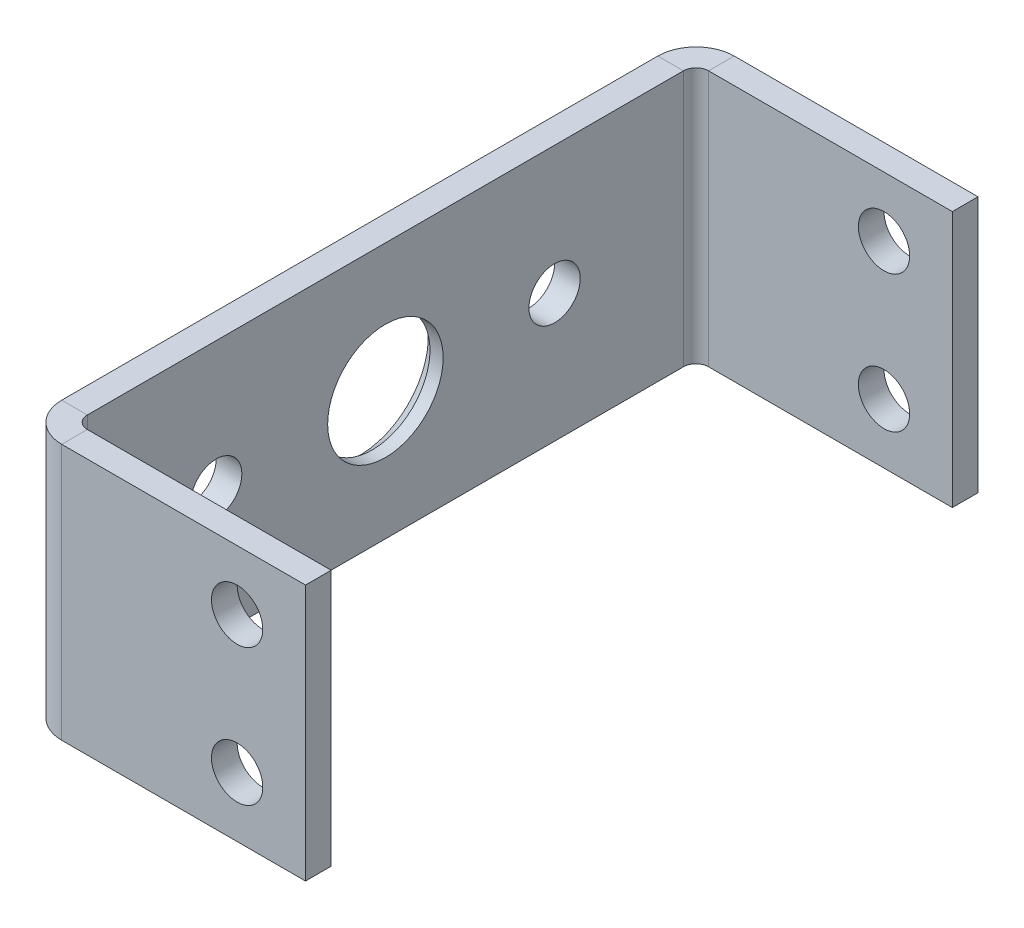
ISO-10303-21;
HEADER;
FILE_DESCRIPTION(('STEP AP214'),'2;1');
FILE_NAME('part.step','',(''),(''),'','','');
FILE_SCHEMA(('AUTOMOTIVE_DESIGN { 1 0 10303 214 1 1 1 1 }'));
ENDSEC;
DATA;
#1=APPLICATION_CONTEXT('core data for automotive mechanical design processes');
#2=APPLICATION_PROTOCOL_DEFINITION('international standard','automotive_design',2000,#1);
#3=PRODUCT_CONTEXT('',#1,'mechanical');
#4=PRODUCT('Part','Part','',(#3));
#5=PRODUCT_RELATED_PRODUCT_CATEGORY('part','',(#4));
#6=PRODUCT_DEFINITION_FORMATION('','',#4);
#7=PRODUCT_DEFINITION_CONTEXT('part definition',#1,'design');
#8=PRODUCT_DEFINITION('design','',#6,#7);
#9=PRODUCT_DEFINITION_SHAPE('','',#8);
#10=(LENGTH_UNIT() NAMED_UNIT(*) SI_UNIT(.MILLI.,.METRE.));
#11=(NAMED_UNIT(*) PLANE_ANGLE_UNIT() SI_UNIT($,.RADIAN.));
#12=(NAMED_UNIT(*) SI_UNIT($,.STERADIAN.) SOLID_ANGLE_UNIT());
#13=UNCERTAINTY_MEASURE_WITH_UNIT(LENGTH_MEASURE(1.E-05),#10,'distance_accuracy_value','');
#14=(GEOMETRIC_REPRESENTATION_CONTEXT(3) GLOBAL_UNCERTAINTY_ASSIGNED_CONTEXT((#13)) GLOBAL_UNIT_ASSIGNED_CONTEXT((#10,
#11,#12)) REPRESENTATION_CONTEXT('',''));
#15=CARTESIAN_POINT('',(0.,0.,0.));
#16=DIRECTION('',(0.,0.,1.));
#17=DIRECTION('',(1.,0.,0.));
#18=AXIS2_PLACEMENT_3D('',#15,#16,#17);
#19=CARTESIAN_POINT('',(0.,7.50000000000002,-17.4383999999999));
#20=DIRECTION('',(0.,1.,0.));
#21=DIRECTION('',(0.,0.,1.));
#22=AXIS2_PLACEMENT_3D('',#19,#20,#21);
#23=PLANE('',#22);
#24=DIRECTION('',(-1.,0.,0.));
#25=VECTOR('',#24,1.);
#26=CARTESIAN_POINT('',(0.,7.50000000000002,-17.4383999999999));
#27=LINE('',#26,#25);
#28=CARTESIAN_POINT('',(0.,7.50000000000002,-17.4383999999999));
#29=VERTEX_POINT('',#28);
#30=CARTESIAN_POINT('',(-1.5,7.50000000000002,-17.4383999999999));
#31=VERTEX_POINT('',#30);
#32=EDGE_CURVE('E11',#29,#31,#27,.T.);
#33=ORIENTED_EDGE('',*,*,#32,.F.);
#34=CARTESIAN_POINT('',(0.736600000000004,7.50000000000002,-17.4383999999999));
#35=DIRECTION('',(0.,-1.,0.));
#36=DIRECTION('',(0.,0.,-1.));
#37=AXIS2_PLACEMENT_3D('',#34,#35,#36);
#38=CIRCLE('',#37,0.7366);
#39=CARTESIAN_POINT('',(0.736600000000004,7.50000000000002,-18.1749999999999));
#40=VERTEX_POINT('',#39);
#41=EDGE_CURVE('E258',#40,#29,#38,.F.);
#42=ORIENTED_EDGE('',*,*,#41,.F.);
#43=DIRECTION('',(0.,0.,1.));
#44=VECTOR('',#43,1.);
#45=CARTESIAN_POINT('',(0.736600000000004,7.50000000000002,-19.6749999999999));
#46=LINE('',#45,#44);
#47=CARTESIAN_POINT('',(0.736600000000004,7.50000000000002,-19.6749999999999));
#48=VERTEX_POINT('',#47);
#49=EDGE_CURVE('E54',#48,#40,#46,.T.);
#50=ORIENTED_EDGE('',*,*,#49,.F.);
#51=CARTESIAN_POINT('',(0.736600000000004,7.50000000000002,-17.4383999999999));
#52=DIRECTION('',(0.,1.,0.));
#53=DIRECTION('',(1.,0.,0.));
#54=AXIS2_PLACEMENT_3D('',#51,#52,#53);
#55=CIRCLE('',#54,2.2366);
#56=EDGE_CURVE('E155',#48,#31,#55,.T.);
#57=ORIENTED_EDGE('',*,*,#56,.T.);
#58=EDGE_LOOP('',(#33,#42,#50,#57));
#59=FACE_BOUND('',#58,.T.);
#60=ADVANCED_FACE('F45',(#59),#23,.T.);
#61=CARTESIAN_POINT('',(0.736600000000004,7.50000000000002,-19.6749999999999));
#62=DIRECTION('',(0.,1.,0.));
#63=DIRECTION('',(0.,0.,1.));
#64=AXIS2_PLACEMENT_3D('',#61,#62,#63);
#65=PLANE('',#64);
#66=DIRECTION('',(0.,0.,1.));
#67=VECTOR('',#66,1.);
#68=CARTESIAN_POINT('',(0.,7.50000000000002,-18.1749999999999));
#69=LINE('',#68,#67);
#70=CARTESIAN_POINT('',(0.,7.50000000000002,17.4384000000001));
#71=VERTEX_POINT('',#70);
#72=EDGE_CURVE('E149',#29,#71,#69,.T.);
#73=ORIENTED_EDGE('',*,*,#72,.F.);
#74=ORIENTED_EDGE('',*,*,#32,.T.);
#75=DIRECTION('',(0.,0.,-1.));
#76=VECTOR('',#75,1.);
#77=CARTESIAN_POINT('',(-1.5,7.50000000000002,-18.1749999999999));
#78=LINE('',#77,#76);
#79=CARTESIAN_POINT('',(-1.5,7.50000000000002,17.4384000000001));
#80=VERTEX_POINT('',#79);
#81=EDGE_CURVE('E146',#31,#80,#78,.F.);
#82=ORIENTED_EDGE('',*,*,#81,.T.);
#83=DIRECTION('',(1.,0.,0.));
#84=VECTOR('',#83,1.);
#85=CARTESIAN_POINT('',(-1.5,7.50000000000002,17.4384000000001));
#86=LINE('',#85,#84);
#87=EDGE_CURVE('E238',#80,#71,#86,.T.);
#88=ORIENTED_EDGE('',*,*,#87,.T.);
#89=EDGE_LOOP('',(#73,#74,#82,#88));
#90=FACE_BOUND('',#89,.T.);
#91=ADVANCED_FACE('F144',(#90),#65,.T.);
#92=CARTESIAN_POINT('',(0.736600000000004,-7.49999999999998,-18.1749999999999));
#93=DIRECTION('',(0.,-1.,0.));
#94=DIRECTION('',(0.,0.,-1.));
#95=AXIS2_PLACEMENT_3D('',#92,#93,#94);
#96=PLANE('',#95);
#97=DIRECTION('',(0.,0.,-1.));
#98=VECTOR('',#97,1.);
#99=CARTESIAN_POINT('',(0.736600000000004,-7.49999999999998,-18.1749999999999));
#100=LINE('',#99,#98);
#101=CARTESIAN_POINT('',(0.736600000000004,-7.49999999999998,-18.1749999999999));
#102=VERTEX_POINT('',#101);
#103=CARTESIAN_POINT('',(0.736600000000004,-7.49999999999998,-19.6749999999999));
#104=VERTEX_POINT('',#103);
#105=EDGE_CURVE('E243',#102,#104,#100,.T.);
#106=ORIENTED_EDGE('',*,*,#105,.F.);
#107=CARTESIAN_POINT('',(0.736600000000004,-7.49999999999998,-17.4383999999999));
#108=DIRECTION('',(0.,-1.,0.));
#109=DIRECTION('',(0.,0.,-1.));
#110=AXIS2_PLACEMENT_3D('',#107,#108,#109);
#111=CIRCLE('',#110,0.7366);
#112=CARTESIAN_POINT('',(0.,-7.49999999999998,-17.4383999999999));
#113=VERTEX_POINT('',#112);
#114=EDGE_CURVE('E195',#102,#113,#111,.F.);
#115=ORIENTED_EDGE('',*,*,#114,.T.);
#116=DIRECTION('',(1.,0.,0.));
#117=VECTOR('',#116,1.);
#118=CARTESIAN_POINT('',(-1.5,-7.49999999999998,-17.4383999999999));
#119=LINE('',#118,#117);
#120=CARTESIAN_POINT('',(-1.5,-7.49999999999998,-17.4383999999999));
#121=VERTEX_POINT('',#120);
#122=EDGE_CURVE('E241',#121,#113,#119,.T.);
#123=ORIENTED_EDGE('',*,*,#122,.F.);
#124=CARTESIAN_POINT('',(0.736600000000004,-7.49999999999998,-17.4383999999999));
#125=DIRECTION('',(0.,1.,0.));
#126=DIRECTION('',(1.,0.,0.));
#127=AXIS2_PLACEMENT_3D('',#124,#125,#126);
#128=CIRCLE('',#127,2.2366);
#129=EDGE_CURVE('E167',#104,#121,#128,.T.);
#130=ORIENTED_EDGE('',*,*,#129,.F.);
#131=EDGE_LOOP('',(#106,#115,#123,#130));
#132=FACE_BOUND('',#131,.T.);
#133=ADVANCED_FACE('F350',(#132),#96,.T.);
#134=CARTESIAN_POINT('',(-1.5,-7.49999999999998,-17.4383999999999));
#135=DIRECTION('',(0.,-1.,0.));
#136=DIRECTION('',(0.,0.,-1.));
#137=AXIS2_PLACEMENT_3D('',#134,#135,#136);
#138=PLANE('',#137);
#139=DIRECTION('',(-1.,0.,0.));
#140=VECTOR('',#139,1.);
#141=CARTESIAN_POINT('',(15.,-7.49999999999998,-18.1749999999999));
#142=LINE('',#141,#140);
#143=CARTESIAN_POINT('',(15.,-7.49999999999998,-18.1749999999999));
#144=VERTEX_POINT('',#143);
#145=EDGE_CURVE('E198',#144,#102,#142,.T.);
#146=ORIENTED_EDGE('',*,*,#145,.T.);
#147=ORIENTED_EDGE('',*,*,#105,.T.);
#148=DIRECTION('',(1.,0.,0.));
#149=VECTOR('',#148,1.);
#150=CARTESIAN_POINT('',(15.,-7.49999999999998,-19.6749999999999));
#151=LINE('',#150,#149);
#152=CARTESIAN_POINT('',(15.,-7.49999999999998,-19.6749999999999));
#153=VERTEX_POINT('',#152);
#154=EDGE_CURVE('E204',#153,#104,#151,.F.);
#155=ORIENTED_EDGE('',*,*,#154,.F.);
#156=DIRECTION('',(0.,0.,1.));
#157=VECTOR('',#156,1.);
#158=CARTESIAN_POINT('',(15.,-7.49999999999998,-19.6749999999999));
#159=LINE('',#158,#157);
#160=EDGE_CURVE('E201',#153,#144,#159,.T.);
#161=ORIENTED_EDGE('',*,*,#160,.T.);
#162=EDGE_LOOP('',(#146,#147,#155,#161));
#163=FACE_BOUND('',#162,.T.);
#164=ADVANCED_FACE('F354',(#163),#138,.T.);
#165=CARTESIAN_POINT('',(0.736600000000004,7.50000000000002,18.1750000000001));
#166=DIRECTION('',(0.,1.,0.));
#167=DIRECTION('',(0.,0.,1.));
#168=AXIS2_PLACEMENT_3D('',#165,#166,#167);
#169=PLANE('',#168);
#170=DIRECTION('',(0.,0.,1.));
#171=VECTOR('',#170,1.);
#172=CARTESIAN_POINT('',(0.736600000000004,7.50000000000002,18.1750000000001));
#173=LINE('',#172,#171);
#174=CARTESIAN_POINT('',(0.736600000000004,7.50000000000002,18.1750000000001));
#175=VERTEX_POINT('',#174);
#176=CARTESIAN_POINT('',(0.736600000000004,7.50000000000002,19.6750000000001));
#177=VERTEX_POINT('',#176);
#178=EDGE_CURVE('E62',#175,#177,#173,.T.);
#179=ORIENTED_EDGE('',*,*,#178,.F.);
#180=CARTESIAN_POINT('',(0.736600000000004,7.50000000000002,17.4384000000001));
#181=DIRECTION('',(0.,-1.,0.));
#182=DIRECTION('',(0.,0.,-1.));
#183=AXIS2_PLACEMENT_3D('',#180,#181,#182);
#184=CIRCLE('',#183,0.7366);
#185=EDGE_CURVE('E268',#71,#175,#184,.F.);
#186=ORIENTED_EDGE('',*,*,#185,.F.);
#187=ORIENTED_EDGE('',*,*,#87,.F.);
#188=CARTESIAN_POINT('',(0.736600000000004,7.50000000000002,17.4384000000001));
#189=DIRECTION('',(0.,1.,0.));
#190=DIRECTION('',(1.,0.,0.));
#191=AXIS2_PLACEMENT_3D('',#188,#189,#190);
#192=CIRCLE('',#191,2.2366);
#193=EDGE_CURVE('E175',#80,#177,#192,.T.);
#194=ORIENTED_EDGE('',*,*,#193,.T.);
#195=EDGE_LOOP('',(#179,#186,#187,#194));
#196=FACE_BOUND('',#195,.T.);
#197=ADVANCED_FACE('F360',(#196),#169,.T.);
#198=CARTESIAN_POINT('',(-1.5,7.50000000000002,17.4384000000001));
#199=DIRECTION('',(0.,1.,0.));
#200=DIRECTION('',(0.,0.,1.));
#201=AXIS2_PLACEMENT_3D('',#198,#199,#200);
#202=PLANE('',#201);
#203=DIRECTION('',(1.,0.,0.));
#204=VECTOR('',#203,1.);
#205=CARTESIAN_POINT('',(0.,7.50000000000002,18.1750000000001));
#206=LINE('',#205,#204);
#207=CARTESIAN_POINT('',(15.,7.50000000000002,18.1750000000001));
#208=VERTEX_POINT('',#207);
#209=EDGE_CURVE('E271',#175,#208,#206,.T.);
#210=ORIENTED_EDGE('',*,*,#209,.F.);
#211=ORIENTED_EDGE('',*,*,#178,.T.);
#212=DIRECTION('',(1.,0.,0.));
#213=VECTOR('',#212,1.);
#214=CARTESIAN_POINT('',(0.,7.50000000000002,19.6750000000001));
#215=LINE('',#214,#213);
#216=CARTESIAN_POINT('',(15.,7.50000000000002,19.6750000000001));
#217=VERTEX_POINT('',#216);
#218=EDGE_CURVE('E116',#177,#217,#215,.T.);
#219=ORIENTED_EDGE('',*,*,#218,.T.);
#220=DIRECTION('',(0.,0.,1.));
#221=VECTOR('',#220,1.);
#222=CARTESIAN_POINT('',(15.,7.50000000000002,18.1750000000001));
#223=LINE('',#222,#221);
#224=EDGE_CURVE('E274',#208,#217,#223,.T.);
#225=ORIENTED_EDGE('',*,*,#224,.F.);
#226=EDGE_LOOP('',(#210,#211,#219,#225));
#227=FACE_BOUND('',#226,.T.);
#228=ADVANCED_FACE('F364',(#227),#202,.T.);
#229=CARTESIAN_POINT('',(0.,-7.49999999999998,17.4384000000001));
#230=DIRECTION('',(0.,-1.,0.));
#231=DIRECTION('',(0.,0.,-1.));
#232=AXIS2_PLACEMENT_3D('',#229,#230,#231);
#233=PLANE('',#232);
#234=DIRECTION('',(-1.,0.,0.));
#235=VECTOR('',#234,1.);
#236=CARTESIAN_POINT('',(0.,-7.49999999999998,17.4384000000001));
#237=LINE('',#236,#235);
#238=CARTESIAN_POINT('',(0.,-7.49999999999998,17.4384000000001));
#239=VERTEX_POINT('',#238);
#240=CARTESIAN_POINT('',(-1.5,-7.49999999999998,17.4384000000001));
#241=VERTEX_POINT('',#240);
#242=EDGE_CURVE('E103',#239,#241,#237,.T.);
#243=ORIENTED_EDGE('',*,*,#242,.F.);
#244=CARTESIAN_POINT('',(0.736600000000004,-7.49999999999998,17.4384000000001));
#245=DIRECTION('',(0.,-1.,0.));
#246=DIRECTION('',(0.,0.,-1.));
#247=AXIS2_PLACEMENT_3D('',#244,#245,#246);
#248=CIRCLE('',#247,0.7366);
#249=CARTESIAN_POINT('',(0.736600000000004,-7.49999999999998,18.1750000000001));
#250=VERTEX_POINT('',#249);
#251=EDGE_CURVE('E191',#239,#250,#248,.F.);
#252=ORIENTED_EDGE('',*,*,#251,.T.);
#253=DIRECTION('',(0.,0.,-1.));
#254=VECTOR('',#253,1.);
#255=CARTESIAN_POINT('',(0.736600000000004,-7.49999999999998,19.6750000000001));
#256=LINE('',#255,#254);
#257=CARTESIAN_POINT('',(0.736600000000004,-7.49999999999998,19.6750000000001));
#258=VERTEX_POINT('',#257);
#259=EDGE_CURVE('E110',#258,#250,#256,.T.);
#260=ORIENTED_EDGE('',*,*,#259,.F.);
#261=CARTESIAN_POINT('',(0.736600000000004,-7.49999999999998,17.4384000000001));
#262=DIRECTION('',(0.,1.,0.));
#263=DIRECTION('',(1.,0.,0.));
#264=AXIS2_PLACEMENT_3D('',#261,#262,#263);
#265=CIRCLE('',#264,2.2366);
#266=EDGE_CURVE('E210',#241,#258,#265,.T.);
#267=ORIENTED_EDGE('',*,*,#266,.F.);
#268=EDGE_LOOP('',(#243,#252,#260,#267));
#269=FACE_BOUND('',#268,.T.);
#270=ADVANCED_FACE('F368',(#269),#233,.T.);
#271=CARTESIAN_POINT('',(0.736600000000004,-7.49999999999998,19.6750000000001));
#272=DIRECTION('',(0.,-1.,0.));
#273=DIRECTION('',(0.,0.,-1.));
#274=AXIS2_PLACEMENT_3D('',#271,#272,#273);
#275=PLANE('',#274);
#276=DIRECTION('',(0.,0.,1.));
#277=VECTOR('',#276,1.);
#278=CARTESIAN_POINT('',(0.,-7.49999999999998,-18.1749999999999));
#279=LINE('',#278,#277);
#280=EDGE_CURVE('E193',#113,#239,#279,.T.);
#281=ORIENTED_EDGE('',*,*,#280,.T.);
#282=ORIENTED_EDGE('',*,*,#242,.T.);
#283=DIRECTION('',(0.,0.,-1.));
#284=VECTOR('',#283,1.);
#285=CARTESIAN_POINT('',(-1.5,-7.49999999999998,-18.1749999999999));
#286=LINE('',#285,#284);
#287=EDGE_CURVE('E208',#121,#241,#286,.F.);
#288=ORIENTED_EDGE('',*,*,#287,.F.);
#289=ORIENTED_EDGE('',*,*,#122,.T.);
#290=EDGE_LOOP('',(#281,#282,#288,#289));
#291=FACE_BOUND('',#290,.T.);
#292=ADVANCED_FACE('F371',(#291),#275,.T.);
#293=CARTESIAN_POINT('',(0.,7.50000000000002,19.6750000000001));
#294=DIRECTION('',(0.,0.,-1.));
#295=DIRECTION('',(-1.,0.,0.));
#296=AXIS2_PLACEMENT_3D('',#293,#294,#295);
#297=PLANE('',#296);
#298=CARTESIAN_POINT('',(11.,-4.,19.6750000000001));
#299=DIRECTION('',(0.,0.,-1.));
#300=DIRECTION('',(-1.,0.,0.));
#301=AXIS2_PLACEMENT_3D('',#298,#299,#300);
#302=CIRCLE('',#301,1.5);
#303=CARTESIAN_POINT('',(9.5,-4.,19.6750000000001));
#304=VERTEX_POINT('',#303);
#305=EDGE_CURVE('E295',#304,#304,#302,.T.);
#306=ORIENTED_EDGE('',*,*,#305,.T.);
#307=EDGE_LOOP('',(#306));
#308=FACE_BOUND('',#307,.T.);
#309=CARTESIAN_POINT('',(11.,4.,19.6750000000001));
#310=DIRECTION('',(0.,0.,-1.));
#311=DIRECTION('',(-1.,0.,0.));
#312=AXIS2_PLACEMENT_3D('',#309,#310,#311);
#313=CIRCLE('',#312,1.49999999999998);
#314=CARTESIAN_POINT('',(9.50000000000002,4.,19.6750000000001));
#315=VERTEX_POINT('',#314);
#316=EDGE_CURVE('E283',#315,#315,#313,.T.);
#317=ORIENTED_EDGE('',*,*,#316,.T.);
#318=EDGE_LOOP('',(#317));
#319=FACE_BOUND('',#318,.T.);
#320=DIRECTION('',(1.,0.,0.));
#321=VECTOR('',#320,1.);
#322=CARTESIAN_POINT('',(0.,-7.49999999999998,19.6750000000001));
#323=LINE('',#322,#321);
#324=CARTESIAN_POINT('',(15.,-7.49999999999998,19.6750000000001));
#325=VERTEX_POINT('',#324);
#326=EDGE_CURVE('E181',#258,#325,#323,.T.);
#327=ORIENTED_EDGE('',*,*,#326,.T.);
#328=DIRECTION('',(0.,-1.,0.));
#329=VECTOR('',#328,1.);
#330=CARTESIAN_POINT('',(15.,7.50000000000002,19.6750000000001));
#331=LINE('',#330,#329);
#332=EDGE_CURVE('E234',#217,#325,#331,.T.);
#333=ORIENTED_EDGE('',*,*,#332,.F.);
#334=ORIENTED_EDGE('',*,*,#218,.F.);
#335=DIRECTION('',(0.,-1.,0.));
#336=VECTOR('',#335,1.);
#337=CARTESIAN_POINT('',(0.736600000000004,7.50000000000002,19.6750000000001));
#338=LINE('',#337,#336);
#339=EDGE_CURVE('E177',#177,#258,#338,.T.);
#340=ORIENTED_EDGE('',*,*,#339,.T.);
#341=EDGE_LOOP('',(#327,#333,#334,#340));
#342=FACE_BOUND('',#341,.T.);
#343=ADVANCED_FACE('F374',(#308,#319,#342),#297,.F.);
#344=CARTESIAN_POINT('',(15.,7.50000000000002,18.1750000000001));
#345=DIRECTION('',(1.,0.,0.));
#346=DIRECTION('',(0.,0.,-1.));
#347=AXIS2_PLACEMENT_3D('',#344,#345,#346);
#348=PLANE('',#347);
#349=DIRECTION('',(0.,0.,1.));
#350=VECTOR('',#349,1.);
#351=CARTESIAN_POINT('',(15.,-7.49999999999998,18.1750000000001));
#352=LINE('',#351,#350);
#353=CARTESIAN_POINT('',(15.,-7.49999999999998,18.1750000000001));
#354=VERTEX_POINT('',#353);
#355=EDGE_CURVE('E184',#354,#325,#352,.T.);
#356=ORIENTED_EDGE('',*,*,#355,.F.);
#357=DIRECTION('',(0.,-1.,0.));
#358=VECTOR('',#357,1.);
#359=CARTESIAN_POINT('',(15.,7.50000000000002,18.1750000000001));
#360=LINE('',#359,#358);
#361=EDGE_CURVE('E232',#208,#354,#360,.T.);
#362=ORIENTED_EDGE('',*,*,#361,.F.);
#363=ORIENTED_EDGE('',*,*,#224,.T.);
#364=ORIENTED_EDGE('',*,*,#332,.T.);
#365=EDGE_LOOP('',(#356,#362,#363,#364));
#366=FACE_BOUND('',#365,.T.);
#367=ADVANCED_FACE('F377',(#366),#348,.T.);
#368=CARTESIAN_POINT('',(0.,7.50000000000002,18.1750000000001));
#369=DIRECTION('',(0.,0.,-1.));
#370=DIRECTION('',(-1.,0.,0.));
#371=AXIS2_PLACEMENT_3D('',#368,#369,#370);
#372=PLANE('',#371);
#373=CARTESIAN_POINT('',(11.,-4.,18.1750000000001));
#374=DIRECTION('',(0.,0.,-1.));
#375=DIRECTION('',(-1.,0.,0.));
#376=AXIS2_PLACEMENT_3D('',#373,#374,#375);
#377=CIRCLE('',#376,1.5);
#378=CARTESIAN_POINT('',(9.5,-4.,18.1750000000001));
#379=VERTEX_POINT('',#378);
#380=EDGE_CURVE('E287',#379,#379,#377,.T.);
#381=ORIENTED_EDGE('',*,*,#380,.F.);
#382=EDGE_LOOP('',(#381));
#383=FACE_BOUND('',#382,.T.);
#384=CARTESIAN_POINT('',(11.,4.,18.1750000000001));
#385=DIRECTION('',(0.,0.,-1.));
#386=DIRECTION('',(-1.,0.,0.));
#387=AXIS2_PLACEMENT_3D('',#384,#385,#386);
#388=CIRCLE('',#387,1.49999999999998);
#389=CARTESIAN_POINT('',(9.50000000000002,4.,18.1750000000001));
#390=VERTEX_POINT('',#389);
#391=EDGE_CURVE('E185',#390,#390,#388,.T.);
#392=ORIENTED_EDGE('',*,*,#391,.F.);
#393=EDGE_LOOP('',(#392));
#394=FACE_BOUND('',#393,.T.);
#395=DIRECTION('',(1.,0.,0.));
#396=VECTOR('',#395,1.);
#397=CARTESIAN_POINT('',(0.,-7.49999999999998,18.1750000000001));
#398=LINE('',#397,#396);
#399=EDGE_CURVE('E188',#250,#354,#398,.T.);
#400=ORIENTED_EDGE('',*,*,#399,.F.);
#401=DIRECTION('',(0.,-1.,0.));
#402=VECTOR('',#401,1.);
#403=CARTESIAN_POINT('',(0.736600000000004,7.50000000000002,18.1750000000001));
#404=LINE('',#403,#402);
#405=EDGE_CURVE('E229',#175,#250,#404,.T.);
#406=ORIENTED_EDGE('',*,*,#405,.F.);
#407=ORIENTED_EDGE('',*,*,#209,.T.);
#408=ORIENTED_EDGE('',*,*,#361,.T.);
#409=EDGE_LOOP('',(#400,#406,#407,#408));
#410=FACE_BOUND('',#409,.T.);
#411=ADVANCED_FACE('F381',(#383,#394,#410),#372,.T.);
#412=CARTESIAN_POINT('',(0.736600000000004,7.50000000000002,17.4384000000001));
#413=DIRECTION('',(0.,-1.,0.));
#414=DIRECTION('',(0.,0.,-1.));
#415=AXIS2_PLACEMENT_3D('',#412,#413,#414);
#416=CYLINDRICAL_SURFACE('',#415,0.7366);
#417=ORIENTED_EDGE('',*,*,#251,.F.);
#418=DIRECTION('',(0.,-1.,0.));
#419=VECTOR('',#418,1.);
#420=CARTESIAN_POINT('',(0.,7.50000000000002,17.4384000000001));
#421=LINE('',#420,#419);
#422=EDGE_CURVE('E226',#71,#239,#421,.T.);
#423=ORIENTED_EDGE('',*,*,#422,.F.);
#424=ORIENTED_EDGE('',*,*,#185,.T.);
#425=ORIENTED_EDGE('',*,*,#405,.T.);
#426=EDGE_LOOP('',(#417,#423,#424,#425));
#427=FACE_BOUND('',#426,.T.);
#428=ADVANCED_FACE('F385',(#427),#416,.F.);
#429=CARTESIAN_POINT('',(0.,7.50000000000002,-18.1749999999999));
#430=DIRECTION('',(1.,0.,0.));
#431=DIRECTION('',(0.,0.,-1.));
#432=AXIS2_PLACEMENT_3D('',#429,#430,#431);
#433=PLANE('',#432);
#434=CARTESIAN_POINT('',(0.,0.,0.));
#435=DIRECTION('',(1.,0.,0.));
#436=DIRECTION('',(0.,0.,-1.));
#437=AXIS2_PLACEMENT_3D('',#434,#435,#436);
#438=CIRCLE('',#437,3.3782);
#439=CARTESIAN_POINT('',(0.,0.,-3.3782));
#440=VERTEX_POINT('',#439);
#441=EDGE_CURVE('E48',#440,#440,#438,.T.);
#442=ORIENTED_EDGE('',*,*,#441,.F.);
#443=EDGE_LOOP('',(#442));
#444=FACE_BOUND('',#443,.T.);
#445=CARTESIAN_POINT('',(0.,3.0162415030313E-13,9.9000000000003));
#446=DIRECTION('',(1.,0.,0.));
#447=DIRECTION('',(0.,1.,0.));
#448=AXIS2_PLACEMENT_3D('',#445,#446,#447);
#449=CIRCLE('',#448,1.5);
#450=CARTESIAN_POINT('',(0.,1.5000000000003,9.9000000000003));
#451=VERTEX_POINT('',#450);
#452=EDGE_CURVE('E310',#451,#451,#449,.T.);
#453=ORIENTED_EDGE('',*,*,#452,.F.);
#454=EDGE_LOOP('',(#453));
#455=FACE_BOUND('',#454,.T.);
#456=CARTESIAN_POINT('',(0.,-3.01624150303112E-13,-9.8999999999997));
#457=DIRECTION('',(1.,0.,0.));
#458=DIRECTION('',(0.,1.,0.));
#459=AXIS2_PLACEMENT_3D('',#456,#457,#458);
#460=CIRCLE('',#459,1.5);
#461=CARTESIAN_POINT('',(0.,1.4999999999997,-9.8999999999997));
#462=VERTEX_POINT('',#461);
#463=EDGE_CURVE('E304',#462,#462,#460,.T.);
#464=ORIENTED_EDGE('',*,*,#463,.F.);
#465=EDGE_LOOP('',(#464));
#466=FACE_BOUND('',#465,.T.);
#467=ORIENTED_EDGE('',*,*,#280,.F.);
#468=DIRECTION('',(0.,-1.,0.));
#469=VECTOR('',#468,1.);
#470=CARTESIAN_POINT('',(0.,7.50000000000002,-17.4383999999999));
#471=LINE('',#470,#469);
#472=EDGE_CURVE('E223',#29,#113,#471,.T.);
#473=ORIENTED_EDGE('',*,*,#472,.F.);
#474=ORIENTED_EDGE('',*,*,#72,.T.);
#475=ORIENTED_EDGE('',*,*,#422,.T.);
#476=EDGE_LOOP('',(#467,#473,#474,#475));
#477=FACE_BOUND('',#476,.T.);
#478=ADVANCED_FACE('F389',(#444,#455,#466,#477),#433,.T.);
#479=CARTESIAN_POINT('',(0.736600000000004,7.50000000000002,-17.4383999999999));
#480=DIRECTION('',(0.,-1.,0.));
#481=DIRECTION('',(0.,0.,-1.));
#482=AXIS2_PLACEMENT_3D('',#479,#480,#481);
#483=CYLINDRICAL_SURFACE('',#482,0.7366);
#484=ORIENTED_EDGE('',*,*,#114,.F.);
#485=DIRECTION('',(0.,-1.,0.));
#486=VECTOR('',#485,1.);
#487=CARTESIAN_POINT('',(0.736600000000004,7.50000000000002,-18.1749999999999));
#488=LINE('',#487,#486);
#489=EDGE_CURVE('E220',#40,#102,#488,.T.);
#490=ORIENTED_EDGE('',*,*,#489,.F.);
#491=ORIENTED_EDGE('',*,*,#41,.T.);
#492=ORIENTED_EDGE('',*,*,#472,.T.);
#493=EDGE_LOOP('',(#484,#490,#491,#492));
#494=FACE_BOUND('',#493,.T.);
#495=ADVANCED_FACE('F257',(#494),#483,.F.);
#496=CARTESIAN_POINT('',(15.,7.50000000000002,-18.1749999999999));
#497=DIRECTION('',(0.,0.,1.));
#498=DIRECTION('',(1.,0.,0.));
#499=AXIS2_PLACEMENT_3D('',#496,#497,#498);
#500=PLANE('',#499);
#501=CARTESIAN_POINT('',(11.,-4.,-18.1749999999999));
#502=DIRECTION('',(0.,0.,1.));
#503=DIRECTION('',(1.,0.,0.));
#504=AXIS2_PLACEMENT_3D('',#501,#502,#503);
#505=CIRCLE('',#504,1.5);
#506=CARTESIAN_POINT('',(12.5,-4.,-18.1749999999999));
#507=VERTEX_POINT('',#506);
#508=EDGE_CURVE('E292',#507,#507,#505,.T.);
#509=ORIENTED_EDGE('',*,*,#508,.F.);
#510=EDGE_LOOP('',(#509));
#511=FACE_BOUND('',#510,.T.);
#512=CARTESIAN_POINT('',(11.,4.,-18.1749999999999));
#513=DIRECTION('',(0.,0.,1.));
#514=DIRECTION('',(1.,0.,0.));
#515=AXIS2_PLACEMENT_3D('',#512,#513,#514);
#516=CIRCLE('',#515,1.49999999999998);
#517=CARTESIAN_POINT('',(12.5,4.,-18.1749999999999));
#518=VERTEX_POINT('',#517);
#519=EDGE_CURVE('E280',#518,#518,#516,.T.);
#520=ORIENTED_EDGE('',*,*,#519,.F.);
#521=EDGE_LOOP('',(#520));
#522=FACE_BOUND('',#521,.T.);
#523=ORIENTED_EDGE('',*,*,#145,.F.);
#524=DIRECTION('',(0.,-1.,0.));
#525=VECTOR('',#524,1.);
#526=CARTESIAN_POINT('',(15.,7.50000000000002,-18.1749999999999));
#527=LINE('',#526,#525);
#528=CARTESIAN_POINT('',(15.,7.50000000000002,-18.1749999999999));
#529=VERTEX_POINT('',#528);
#530=EDGE_CURVE('E218',#529,#144,#527,.T.);
#531=ORIENTED_EDGE('',*,*,#530,.F.);
#532=DIRECTION('',(-1.,0.,0.));
#533=VECTOR('',#532,1.);
#534=CARTESIAN_POINT('',(15.,7.50000000000002,-18.1749999999999));
#535=LINE('',#534,#533);
#536=EDGE_CURVE('E251',#529,#40,#535,.T.);
#537=ORIENTED_EDGE('',*,*,#536,.T.);
#538=ORIENTED_EDGE('',*,*,#489,.T.);
#539=EDGE_LOOP('',(#523,#531,#537,#538));
#540=FACE_BOUND('',#539,.T.);
#541=ADVANCED_FACE('F262',(#511,#522,#540),#500,.T.);
#542=CARTESIAN_POINT('',(15.,7.50000000000002,-19.6749999999999));
#543=DIRECTION('',(1.,0.,0.));
#544=DIRECTION('',(0.,0.,-1.));
#545=AXIS2_PLACEMENT_3D('',#542,#543,#544);
#546=PLANE('',#545);
#547=ORIENTED_EDGE('',*,*,#160,.F.);
#548=DIRECTION('',(0.,-1.,0.));
#549=VECTOR('',#548,1.);
#550=CARTESIAN_POINT('',(15.,7.50000000000002,-19.6749999999999));
#551=LINE('',#550,#549);
#552=CARTESIAN_POINT('',(15.,7.50000000000002,-19.6749999999999));
#553=VERTEX_POINT('',#552);
#554=EDGE_CURVE('E216',#553,#153,#551,.T.);
#555=ORIENTED_EDGE('',*,*,#554,.F.);
#556=DIRECTION('',(0.,0.,1.));
#557=VECTOR('',#556,1.);
#558=CARTESIAN_POINT('',(15.,7.50000000000002,-19.6749999999999));
#559=LINE('',#558,#557);
#560=EDGE_CURVE('E263',#553,#529,#559,.T.);
#561=ORIENTED_EDGE('',*,*,#560,.T.);
#562=ORIENTED_EDGE('',*,*,#530,.T.);
#563=EDGE_LOOP('',(#547,#555,#561,#562));
#564=FACE_BOUND('',#563,.T.);
#565=ADVANCED_FACE('F398',(#564),#546,.T.);
#566=CARTESIAN_POINT('',(15.,7.50000000000002,-19.6749999999999));
#567=DIRECTION('',(0.,0.,1.));
#568=DIRECTION('',(1.,0.,0.));
#569=AXIS2_PLACEMENT_3D('',#566,#567,#568);
#570=PLANE('',#569);
#571=CARTESIAN_POINT('',(11.,-4.,-19.6749999999999));
#572=DIRECTION('',(0.,0.,-1.));
#573=DIRECTION('',(-1.,0.,0.));
#574=AXIS2_PLACEMENT_3D('',#571,#572,#573);
#575=CIRCLE('',#574,1.5);
#576=CARTESIAN_POINT('',(9.5,-4.,-19.6749999999999));
#577=VERTEX_POINT('',#576);
#578=EDGE_CURVE('E296',#577,#577,#575,.T.);
#579=ORIENTED_EDGE('',*,*,#578,.F.);
#580=EDGE_LOOP('',(#579));
#581=FACE_BOUND('',#580,.T.);
#582=CARTESIAN_POINT('',(11.,4.,-19.6749999999999));
#583=DIRECTION('',(0.,0.,-1.));
#584=DIRECTION('',(-1.,0.,0.));
#585=AXIS2_PLACEMENT_3D('',#582,#583,#584);
#586=CIRCLE('',#585,1.49999999999998);
#587=CARTESIAN_POINT('',(9.50000000000002,4.,-19.6749999999999));
#588=VERTEX_POINT('',#587);
#589=EDGE_CURVE('E284',#588,#588,#586,.T.);
#590=ORIENTED_EDGE('',*,*,#589,.F.);
#591=EDGE_LOOP('',(#590));
#592=FACE_BOUND('',#591,.T.);
#593=ORIENTED_EDGE('',*,*,#154,.T.);
#594=DIRECTION('',(0.,-1.,0.));
#595=VECTOR('',#594,1.);
#596=CARTESIAN_POINT('',(0.736600000000004,7.50000000000002,-19.6749999999999));
#597=LINE('',#596,#595);
#598=EDGE_CURVE('E169',#48,#104,#597,.T.);
#599=ORIENTED_EDGE('',*,*,#598,.F.);
#600=DIRECTION('',(1.,0.,0.));
#601=VECTOR('',#600,1.);
#602=CARTESIAN_POINT('',(15.,7.50000000000002,-19.6749999999999));
#603=LINE('',#602,#601);
#604=EDGE_CURVE('E160',#553,#48,#603,.F.);
#605=ORIENTED_EDGE('',*,*,#604,.F.);
#606=ORIENTED_EDGE('',*,*,#554,.T.);
#607=EDGE_LOOP('',(#593,#599,#605,#606));
#608=FACE_BOUND('',#607,.T.);
#609=ADVANCED_FACE('F402',(#581,#592,#608),#570,.F.);
#610=CARTESIAN_POINT('',(0.736600000000004,7.50000000000002,-17.4383999999999));
#611=DIRECTION('',(0.,-1.,0.));
#612=DIRECTION('',(0.,0.,-1.));
#613=AXIS2_PLACEMENT_3D('',#610,#611,#612);
#614=CYLINDRICAL_SURFACE('',#613,2.2366);
#615=ORIENTED_EDGE('',*,*,#129,.T.);
#616=DIRECTION('',(0.,-1.,0.));
#617=VECTOR('',#616,1.);
#618=CARTESIAN_POINT('',(-1.5,7.50000000000002,-17.4383999999999));
#619=LINE('',#618,#617);
#620=EDGE_CURVE('E164',#31,#121,#619,.T.);
#621=ORIENTED_EDGE('',*,*,#620,.F.);
#622=ORIENTED_EDGE('',*,*,#56,.F.);
#623=ORIENTED_EDGE('',*,*,#598,.T.);
#624=EDGE_LOOP('',(#615,#621,#622,#623));
#625=FACE_BOUND('',#624,.T.);
#626=ADVANCED_FACE('F165',(#625),#614,.T.);
#627=CARTESIAN_POINT('',(-1.5,7.50000000000002,-18.1749999999999));
#628=DIRECTION('',(1.,0.,0.));
#629=DIRECTION('',(0.,0.,-1.));
#630=AXIS2_PLACEMENT_3D('',#627,#628,#629);
#631=PLANE('',#630);
#632=CARTESIAN_POINT('',(-1.5,0.,0.));
#633=DIRECTION('',(-1.,0.,0.));
#634=DIRECTION('',(0.,0.,1.));
#635=AXIS2_PLACEMENT_3D('',#632,#633,#634);
#636=CIRCLE('',#635,4.0132);
#637=CARTESIAN_POINT('',(-1.5,0.,4.0132));
#638=VERTEX_POINT('',#637);
#639=EDGE_CURVE('E316',#638,#638,#636,.T.);
#640=ORIENTED_EDGE('',*,*,#639,.F.);
#641=EDGE_LOOP('',(#640));
#642=FACE_BOUND('',#641,.T.);
#643=CARTESIAN_POINT('',(-1.5,3.01457616849436E-13,9.9000000000003));
#644=DIRECTION('',(1.,0.,0.));
#645=DIRECTION('',(0.,0.,-1.));
#646=AXIS2_PLACEMENT_3D('',#643,#644,#645);
#647=CIRCLE('',#646,1.5);
#648=CARTESIAN_POINT('',(-1.5,3.01457616849436E-13,8.4000000000003));
#649=VERTEX_POINT('',#648);
#650=EDGE_CURVE('E307',#649,#649,#647,.F.);
#651=ORIENTED_EDGE('',*,*,#650,.F.);
#652=EDGE_LOOP('',(#651));
#653=FACE_BOUND('',#652,.T.);
#654=CARTESIAN_POINT('',(-1.5,-3.01790683756805E-13,-9.8999999999997));
#655=DIRECTION('',(1.,0.,0.));
#656=DIRECTION('',(0.,0.,-1.));
#657=AXIS2_PLACEMENT_3D('',#654,#655,#656);
#658=CIRCLE('',#657,1.5);
#659=CARTESIAN_POINT('',(-1.5,-3.01790683756805E-13,-11.3999999999997));
#660=VERTEX_POINT('',#659);
#661=EDGE_CURVE('E299',#660,#660,#658,.F.);
#662=ORIENTED_EDGE('',*,*,#661,.F.);
#663=EDGE_LOOP('',(#662));
#664=FACE_BOUND('',#663,.T.);
#665=ORIENTED_EDGE('',*,*,#287,.T.);
#666=DIRECTION('',(0.,-1.,0.));
#667=VECTOR('',#666,1.);
#668=CARTESIAN_POINT('',(-1.5,7.50000000000002,17.4384000000001));
#669=LINE('',#668,#667);
#670=EDGE_CURVE('E170',#80,#241,#669,.T.);
#671=ORIENTED_EDGE('',*,*,#670,.F.);
#672=ORIENTED_EDGE('',*,*,#81,.F.);
#673=ORIENTED_EDGE('',*,*,#620,.T.);
#674=EDGE_LOOP('',(#665,#671,#672,#673));
#675=FACE_BOUND('',#674,.T.);
#676=ADVANCED_FACE('F172',(#642,#653,#664,#675),#631,.F.);
#677=CARTESIAN_POINT('',(0.736600000000004,7.50000000000002,17.4384000000001));
#678=DIRECTION('',(0.,-1.,0.));
#679=DIRECTION('',(0.,0.,-1.));
#680=AXIS2_PLACEMENT_3D('',#677,#678,#679);
#681=CYLINDRICAL_SURFACE('',#680,2.2366);
#682=ORIENTED_EDGE('',*,*,#266,.T.);
#683=ORIENTED_EDGE('',*,*,#339,.F.);
#684=ORIENTED_EDGE('',*,*,#193,.F.);
#685=ORIENTED_EDGE('',*,*,#670,.T.);
#686=EDGE_LOOP('',(#682,#683,#684,#685));
#687=FACE_BOUND('',#686,.T.);
#688=ADVANCED_FACE('F324',(#687),#681,.T.);
#689=CARTESIAN_POINT('',(0.736600000000004,7.50000000000002,17.4384000000001));
#690=DIRECTION('',(0.,-1.,0.));
#691=DIRECTION('',(-1.,0.,0.));
#692=AXIS2_PLACEMENT_3D('',#689,#690,#691);
#693=PLANE('',#692);
#694=ORIENTED_EDGE('',*,*,#604,.T.);
#695=ORIENTED_EDGE('',*,*,#49,.T.);
#696=ORIENTED_EDGE('',*,*,#536,.F.);
#697=ORIENTED_EDGE('',*,*,#560,.F.);
#698=EDGE_LOOP('',(#694,#695,#696,#697));
#699=FACE_BOUND('',#698,.T.);
#700=ADVANCED_FACE('F248',(#699),#693,.F.);
#701=CARTESIAN_POINT('',(0.736600000000004,-7.49999999999998,17.4384000000001));
#702=DIRECTION('',(0.,-1.,0.));
#703=DIRECTION('',(-1.,0.,0.));
#704=AXIS2_PLACEMENT_3D('',#701,#702,#703);
#705=PLANE('',#704);
#706=ORIENTED_EDGE('',*,*,#326,.F.);
#707=ORIENTED_EDGE('',*,*,#259,.T.);
#708=ORIENTED_EDGE('',*,*,#399,.T.);
#709=ORIENTED_EDGE('',*,*,#355,.T.);
#710=EDGE_LOOP('',(#706,#707,#708,#709));
#711=FACE_BOUND('',#710,.T.);
#712=ADVANCED_FACE('F412',(#711),#705,.T.);
#713=CARTESIAN_POINT('',(11.,4.,19.6750000000001));
#714=DIRECTION('',(0.,0.,-1.));
#715=DIRECTION('',(-1.,0.,0.));
#716=AXIS2_PLACEMENT_3D('',#713,#714,#715);
#717=CYLINDRICAL_SURFACE('',#716,1.49999999999998);
#718=ORIENTED_EDGE('',*,*,#519,.T.);
#719=EDGE_LOOP('',(#718));
#720=FACE_BOUND('',#719,.T.);
#721=ORIENTED_EDGE('',*,*,#589,.T.);
#722=EDGE_LOOP('',(#721));
#723=FACE_BOUND('',#722,.T.);
#724=ADVANCED_FACE('F415',(#720,#723),#717,.F.);
#725=ORIENTED_EDGE('',*,*,#391,.T.);
#726=EDGE_LOOP('',(#725));
#727=FACE_BOUND('',#726,.T.);
#728=ORIENTED_EDGE('',*,*,#316,.F.);
#729=EDGE_LOOP('',(#728));
#730=FACE_BOUND('',#729,.T.);
#731=ADVANCED_FACE('F420',(#727,#730),#717,.F.);
#732=CARTESIAN_POINT('',(11.,-4.,19.6750000000001));
#733=DIRECTION('',(0.,0.,-1.));
#734=DIRECTION('',(-1.,0.,0.));
#735=AXIS2_PLACEMENT_3D('',#732,#733,#734);
#736=CYLINDRICAL_SURFACE('',#735,1.5);
#737=ORIENTED_EDGE('',*,*,#508,.T.);
#738=EDGE_LOOP('',(#737));
#739=FACE_BOUND('',#738,.T.);
#740=ORIENTED_EDGE('',*,*,#578,.T.);
#741=EDGE_LOOP('',(#740));
#742=FACE_BOUND('',#741,.T.);
#743=ADVANCED_FACE('F343',(#739,#742),#736,.F.);
#744=ORIENTED_EDGE('',*,*,#380,.T.);
#745=EDGE_LOOP('',(#744));
#746=FACE_BOUND('',#745,.T.);
#747=ORIENTED_EDGE('',*,*,#305,.F.);
#748=EDGE_LOOP('',(#747));
#749=FACE_BOUND('',#748,.T.);
#750=ADVANCED_FACE('F333',(#746,#749),#736,.F.);
#751=CARTESIAN_POINT('',(-1.501,-3.01790794779108E-13,-9.8999999999997));
#752=DIRECTION('',(1.,0.,0.));
#753=DIRECTION('',(0.,1.,0.));
#754=AXIS2_PLACEMENT_3D('',#751,#752,#753);
#755=CYLINDRICAL_SURFACE('',#754,1.5);
#756=ORIENTED_EDGE('',*,*,#463,.T.);
#757=EDGE_LOOP('',(#756));
#758=FACE_BOUND('',#757,.T.);
#759=ORIENTED_EDGE('',*,*,#661,.T.);
#760=EDGE_LOOP('',(#759));
#761=FACE_BOUND('',#760,.T.);
#762=ADVANCED_FACE('F330',(#758,#761),#755,.F.);
#763=CARTESIAN_POINT('',(-1.501,3.01457505827134E-13,9.9000000000003));
#764=DIRECTION('',(1.,0.,0.));
#765=DIRECTION('',(0.,1.,0.));
#766=AXIS2_PLACEMENT_3D('',#763,#764,#765);
#767=CYLINDRICAL_SURFACE('',#766,1.5);
#768=ORIENTED_EDGE('',*,*,#452,.T.);
#769=EDGE_LOOP('',(#768));
#770=FACE_BOUND('',#769,.T.);
#771=ORIENTED_EDGE('',*,*,#650,.T.);
#772=EDGE_LOOP('',(#771));
#773=FACE_BOUND('',#772,.T.);
#774=ADVANCED_FACE('F332',(#770,#773),#767,.F.);
#775=CARTESIAN_POINT('',(-1.5,0.,0.));
#776=DIRECTION('',(-1.,0.,0.));
#777=DIRECTION('',(0.,0.,1.));
#778=AXIS2_PLACEMENT_3D('',#775,#776,#777);
#779=CYLINDRICAL_SURFACE('',#778,3.3782);
#780=ORIENTED_EDGE('',*,*,#441,.T.);
#781=EDGE_LOOP('',(#780));
#782=FACE_BOUND('',#781,.T.);
#783=CARTESIAN_POINT('',(-0.76951606141466,0.,0.));
#784=DIRECTION('',(-1.,0.,0.));
#785=DIRECTION('',(0.,0.,1.));
#786=AXIS2_PLACEMENT_3D('',#783,#784,#785);
#787=CIRCLE('',#786,3.3782);
#788=CARTESIAN_POINT('',(-0.76951606141466,0.,3.3782));
#789=VERTEX_POINT('',#788);
#790=EDGE_CURVE('E313',#789,#789,#787,.T.);
#791=ORIENTED_EDGE('',*,*,#790,.T.);
#792=EDGE_LOOP('',(#791));
#793=FACE_BOUND('',#792,.T.);
#794=ADVANCED_FACE('F340',(#782,#793),#779,.F.);
#795=CARTESIAN_POINT('',(-1.5,0.,0.));
#796=DIRECTION('',(-1.,0.,0.));
#797=DIRECTION('',(0.,0.,1.));
#798=AXIS2_PLACEMENT_3D('',#795,#796,#797);
#799=CONICAL_SURFACE('',#798,4.0132,0.715584993317675);
#800=ORIENTED_EDGE('',*,*,#790,.F.);
#801=EDGE_LOOP('',(#800));
#802=FACE_BOUND('',#801,.T.);
#803=ORIENTED_EDGE('',*,*,#639,.T.);
#804=EDGE_LOOP('',(#803));
#805=FACE_BOUND('',#804,.T.);
#806=ADVANCED_FACE('F320',(#802,#805),#799,.F.);
#807=CLOSED_SHELL('',(#60,#91,#133,#164,#197,#228,#270,#292,#343,#367,#411,#428,#478,#495,#541,
#565,#609,#626,#676,#688,#700,#712,#724,#731,#743,#750,#762,#774,#794,#806));
#808=MANIFOLD_SOLID_BREP('B2',#807);
#809=ADVANCED_BREP_SHAPE_REPRESENTATION('',(#18,#808),#14);
#810=SHAPE_DEFINITION_REPRESENTATION(#9,#809);
ENDSEC;
END-ISO-10303-21;
